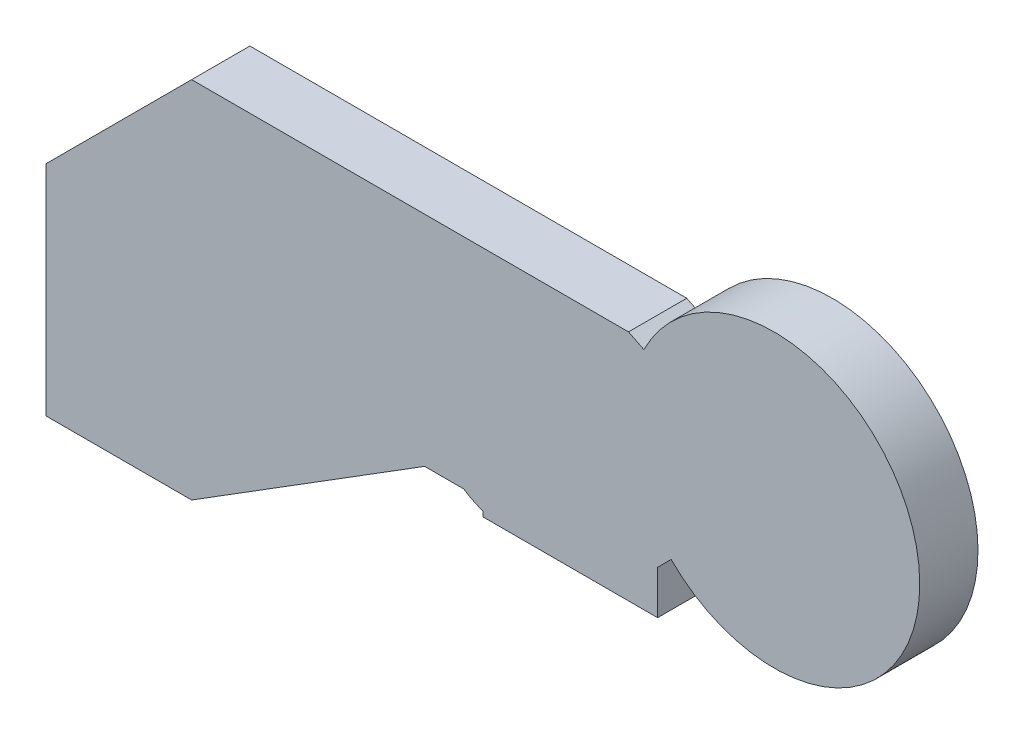
ISO-10303-21;
HEADER;
FILE_DESCRIPTION(('STEP AP214'),'2;1');
FILE_NAME('part.step','',(''),(''),'','','');
FILE_SCHEMA(('AUTOMOTIVE_DESIGN { 1 0 10303 214 1 1 1 1 }'));
ENDSEC;
DATA;
#1=APPLICATION_CONTEXT('core data for automotive mechanical design processes');
#2=APPLICATION_PROTOCOL_DEFINITION('international standard','automotive_design',2000,#1);
#3=PRODUCT_CONTEXT('',#1,'mechanical');
#4=PRODUCT('Part','Part','',(#3));
#5=PRODUCT_RELATED_PRODUCT_CATEGORY('part','',(#4));
#6=PRODUCT_DEFINITION_FORMATION('','',#4);
#7=PRODUCT_DEFINITION_CONTEXT('part definition',#1,'design');
#8=PRODUCT_DEFINITION('design','',#6,#7);
#9=PRODUCT_DEFINITION_SHAPE('','',#8);
#10=(LENGTH_UNIT() NAMED_UNIT(*) SI_UNIT(.MILLI.,.METRE.));
#11=(NAMED_UNIT(*) PLANE_ANGLE_UNIT() SI_UNIT($,.RADIAN.));
#12=(NAMED_UNIT(*) SI_UNIT($,.STERADIAN.) SOLID_ANGLE_UNIT());
#13=UNCERTAINTY_MEASURE_WITH_UNIT(LENGTH_MEASURE(1.E-05),#10,'distance_accuracy_value','');
#14=(GEOMETRIC_REPRESENTATION_CONTEXT(3) GLOBAL_UNCERTAINTY_ASSIGNED_CONTEXT((#13)) GLOBAL_UNIT_ASSIGNED_CONTEXT((#10,
#11,#12)) REPRESENTATION_CONTEXT('',''));
#15=CARTESIAN_POINT('',(0.,0.,0.));
#16=DIRECTION('',(0.,0.,1.));
#17=DIRECTION('',(1.,0.,0.));
#18=AXIS2_PLACEMENT_3D('',#15,#16,#17);
#19=CARTESIAN_POINT('',(40.,0.,4.));
#20=DIRECTION('',(-0.707106781186549,0.707106781186546,0.));
#21=DIRECTION('',(-0.707106781186546,-0.707106781186549,0.));
#22=AXIS2_PLACEMENT_3D('',#19,#20,#21);
#23=PLANE('',#22);
#24=DIRECTION('',(0.,0.,1.));
#25=VECTOR('',#24,1.);
#26=CARTESIAN_POINT('',(42.,2.00000000000001,4.));
#27=LINE('',#26,#25);
#28=CARTESIAN_POINT('',(42.,2.00000000000001,0.));
#29=VERTEX_POINT('',#28);
#30=CARTESIAN_POINT('',(42.,2.00000000000001,4.));
#31=VERTEX_POINT('',#30);
#32=EDGE_CURVE('E59',#29,#31,#27,.T.);
#33=ORIENTED_EDGE('',*,*,#32,.F.);
#34=DIRECTION('',(0.707106781186546,0.707106781186549,0.));
#35=VECTOR('',#34,1.);
#36=CARTESIAN_POINT('',(40.,0.,0.));
#37=LINE('',#36,#35);
#38=CARTESIAN_POINT('',(42.9289321881345,2.92893218813452,0.));
#39=VERTEX_POINT('',#38);
#40=EDGE_CURVE('E208',#29,#39,#37,.T.);
#41=ORIENTED_EDGE('',*,*,#40,.T.);
#42=DIRECTION('',(0.,0.,-1.));
#43=VECTOR('',#42,1.);
#44=CARTESIAN_POINT('',(42.9289321881345,2.92893218813452,4.));
#45=LINE('',#44,#43);
#46=CARTESIAN_POINT('',(42.9289321881345,2.92893218813452,4.));
#47=VERTEX_POINT('',#46);
#48=EDGE_CURVE('E176',#47,#39,#45,.T.);
#49=ORIENTED_EDGE('',*,*,#48,.F.);
#50=DIRECTION('',(0.707106781186546,0.707106781186549,0.));
#51=VECTOR('',#50,1.);
#52=CARTESIAN_POINT('',(40.,0.,4.));
#53=LINE('',#52,#51);
#54=EDGE_CURVE('E53',#31,#47,#53,.T.);
#55=ORIENTED_EDGE('',*,*,#54,.F.);
#56=EDGE_LOOP('',(#33,#41,#49,#55));
#57=FACE_BOUND('',#56,.T.);
#58=ADVANCED_FACE('F39',(#57),#23,.F.);
#59=CARTESIAN_POINT('',(32.,5.,4.));
#60=DIRECTION('',(0.,0.,-1.));
#61=DIRECTION('',(-1.,0.,0.));
#62=AXIS2_PLACEMENT_3D('',#59,#60,#61);
#63=CYLINDRICAL_SURFACE('',#62,6.);
#64=DIRECTION('',(0.,0.,-1.));
#65=VECTOR('',#64,1.);
#66=CARTESIAN_POINT('',(30.,-0.656854249492381,4.));
#67=LINE('',#66,#65);
#68=CARTESIAN_POINT('',(30.,-0.656854249492381,4.));
#69=VERTEX_POINT('',#68);
#70=CARTESIAN_POINT('',(30.,-0.656854249492381,0.));
#71=VERTEX_POINT('',#70);
#72=EDGE_CURVE('E11',#69,#71,#67,.T.);
#73=ORIENTED_EDGE('',*,*,#72,.F.);
#74=CARTESIAN_POINT('',(32.,5.,4.));
#75=DIRECTION('',(0.,0.,1.));
#76=DIRECTION('',(1.,0.,0.));
#77=AXIS2_PLACEMENT_3D('',#74,#75,#76);
#78=CIRCLE('',#77,6.);
#79=CARTESIAN_POINT('',(28.6833752096446,0.,4.));
#80=VERTEX_POINT('',#79);
#81=EDGE_CURVE('E136',#80,#69,#78,.T.);
#82=ORIENTED_EDGE('',*,*,#81,.F.);
#83=DIRECTION('',(0.,0.,-1.));
#84=VECTOR('',#83,1.);
#85=CARTESIAN_POINT('',(28.6833752096446,0.,4.));
#86=LINE('',#85,#84);
#87=CARTESIAN_POINT('',(28.6833752096446,0.,0.));
#88=VERTEX_POINT('',#87);
#89=EDGE_CURVE('E164',#80,#88,#86,.T.);
#90=ORIENTED_EDGE('',*,*,#89,.T.);
#91=CARTESIAN_POINT('',(32.,5.,0.));
#92=DIRECTION('',(0.,0.,1.));
#93=DIRECTION('',(1.,0.,0.));
#94=AXIS2_PLACEMENT_3D('',#91,#92,#93);
#95=CIRCLE('',#94,6.);
#96=EDGE_CURVE('E157',#88,#71,#95,.T.);
#97=ORIENTED_EDGE('',*,*,#96,.T.);
#98=EDGE_LOOP('',(#73,#82,#90,#97));
#99=FACE_BOUND('',#98,.T.);
#100=ADVANCED_FACE('F252',(#99),#63,.T.);
#101=CARTESIAN_POINT('',(26.,0.,4.));
#102=DIRECTION('',(0.,1.,0.));
#103=DIRECTION('',(0.,0.,1.));
#104=AXIS2_PLACEMENT_3D('',#101,#102,#103);
#105=PLANE('',#104);
#106=ORIENTED_EDGE('',*,*,#89,.F.);
#107=DIRECTION('',(1.,0.,0.));
#108=VECTOR('',#107,1.);
#109=CARTESIAN_POINT('',(26.,0.,4.));
#110=LINE('',#109,#108);
#111=CARTESIAN_POINT('',(26.,0.,4.));
#112=VERTEX_POINT('',#111);
#113=EDGE_CURVE('E187',#112,#80,#110,.T.);
#114=ORIENTED_EDGE('',*,*,#113,.F.);
#115=DIRECTION('',(0.,0.,-1.));
#116=VECTOR('',#115,1.);
#117=CARTESIAN_POINT('',(26.,0.,4.));
#118=LINE('',#117,#116);
#119=CARTESIAN_POINT('',(26.,0.,0.));
#120=VERTEX_POINT('',#119);
#121=EDGE_CURVE('E224',#112,#120,#118,.T.);
#122=ORIENTED_EDGE('',*,*,#121,.T.);
#123=DIRECTION('',(1.,0.,0.));
#124=VECTOR('',#123,1.);
#125=CARTESIAN_POINT('',(26.,0.,0.));
#126=LINE('',#125,#124);
#127=EDGE_CURVE('E206',#120,#88,#126,.T.);
#128=ORIENTED_EDGE('',*,*,#127,.T.);
#129=EDGE_LOOP('',(#106,#114,#122,#128));
#130=FACE_BOUND('',#129,.T.);
#131=ADVANCED_FACE('F246',(#130),#105,.F.);
#132=CARTESIAN_POINT('',(50.,10.,4.));
#133=DIRECTION('',(-0.447213595499957,-0.894427190999917,0.));
#134=DIRECTION('',(0.894427190999917,-0.447213595499957,0.));
#135=AXIS2_PLACEMENT_3D('',#132,#133,#134);
#136=PLANE('',#135);
#137=DIRECTION('',(0.,0.,-1.));
#138=VECTOR('',#137,1.);
#139=CARTESIAN_POINT('',(41.0557280900008,14.4721359549996,4.));
#140=LINE('',#139,#138);
#141=CARTESIAN_POINT('',(41.0557280900008,14.4721359549996,0.));
#142=VERTEX_POINT('',#141);
#143=CARTESIAN_POINT('',(41.0557280900008,14.4721359549996,4.));
#144=VERTEX_POINT('',#143);
#145=EDGE_CURVE('E175',#142,#144,#140,.F.);
#146=ORIENTED_EDGE('',*,*,#145,.F.);
#147=DIRECTION('',(-0.894427190999916,0.447213595499957,0.));
#148=VECTOR('',#147,1.);
#149=CARTESIAN_POINT('',(50.,10.,0.));
#150=LINE('',#149,#148);
#151=CARTESIAN_POINT('',(40.,15.,0.));
#152=VERTEX_POINT('',#151);
#153=EDGE_CURVE('E209',#142,#152,#150,.T.);
#154=ORIENTED_EDGE('',*,*,#153,.T.);
#155=DIRECTION('',(0.,0.,-1.));
#156=VECTOR('',#155,1.);
#157=CARTESIAN_POINT('',(40.,15.,4.));
#158=LINE('',#157,#156);
#159=CARTESIAN_POINT('',(40.,15.,4.));
#160=VERTEX_POINT('',#159);
#161=EDGE_CURVE('E219',#160,#152,#158,.T.);
#162=ORIENTED_EDGE('',*,*,#161,.F.);
#163=DIRECTION('',(-0.894427190999916,0.447213595499957,0.));
#164=VECTOR('',#163,1.);
#165=CARTESIAN_POINT('',(50.,10.,4.));
#166=LINE('',#165,#164);
#167=EDGE_CURVE('E192',#144,#160,#166,.T.);
#168=ORIENTED_EDGE('',*,*,#167,.F.);
#169=EDGE_LOOP('',(#146,#154,#162,#168));
#170=FACE_BOUND('',#169,.T.);
#171=ADVANCED_FACE('F269',(#170),#136,.F.);
#172=CARTESIAN_POINT('',(0.,4.99999999999996,4.));
#173=DIRECTION('',(1.,0.,0.));
#174=DIRECTION('',(0.,1.,0.));
#175=AXIS2_PLACEMENT_3D('',#172,#173,#174);
#176=PLANE('',#175);
#177=DIRECTION('',(0.,-1.,0.));
#178=VECTOR('',#177,1.);
#179=CARTESIAN_POINT('',(0.,4.99999999999996,0.));
#180=LINE('',#179,#178);
#181=CARTESIAN_POINT('',(0.,4.99999999999996,0.));
#182=VERTEX_POINT('',#181);
#183=CARTESIAN_POINT('',(0.,-10.,0.));
#184=VERTEX_POINT('',#183);
#185=EDGE_CURVE('E182',#182,#184,#180,.T.);
#186=ORIENTED_EDGE('',*,*,#185,.T.);
#187=DIRECTION('',(0.,0.,-1.));
#188=VECTOR('',#187,1.);
#189=CARTESIAN_POINT('',(0.,-10.,4.));
#190=LINE('',#189,#188);
#191=CARTESIAN_POINT('',(0.,-10.,4.));
#192=VERTEX_POINT('',#191);
#193=EDGE_CURVE('E50',#192,#184,#190,.T.);
#194=ORIENTED_EDGE('',*,*,#193,.F.);
#195=DIRECTION('',(0.,-1.,0.));
#196=VECTOR('',#195,1.);
#197=CARTESIAN_POINT('',(0.,4.99999999999996,4.));
#198=LINE('',#197,#196);
#199=CARTESIAN_POINT('',(0.,4.99999999999996,4.));
#200=VERTEX_POINT('',#199);
#201=EDGE_CURVE('E185',#200,#192,#198,.T.);
#202=ORIENTED_EDGE('',*,*,#201,.F.);
#203=DIRECTION('',(0.,0.,-1.));
#204=VECTOR('',#203,1.);
#205=CARTESIAN_POINT('',(0.,4.99999999999996,4.));
#206=LINE('',#205,#204);
#207=EDGE_CURVE('E200',#200,#182,#206,.T.);
#208=ORIENTED_EDGE('',*,*,#207,.T.);
#209=EDGE_LOOP('',(#186,#194,#202,#208));
#210=FACE_BOUND('',#209,.T.);
#211=ADVANCED_FACE('F41',(#210),#176,.F.);
#212=CARTESIAN_POINT('',(0.,-10.,4.));
#213=DIRECTION('',(0.,1.,0.));
#214=DIRECTION('',(0.,0.,1.));
#215=AXIS2_PLACEMENT_3D('',#212,#213,#214);
#216=PLANE('',#215);
#217=DIRECTION('',(1.,0.,0.));
#218=VECTOR('',#217,1.);
#219=CARTESIAN_POINT('',(0.,-10.,0.));
#220=LINE('',#219,#218);
#221=CARTESIAN_POINT('',(10.,-10.,0.));
#222=VERTEX_POINT('',#221);
#223=EDGE_CURVE('E205',#184,#222,#220,.T.);
#224=ORIENTED_EDGE('',*,*,#223,.T.);
#225=DIRECTION('',(0.,0.,-1.));
#226=VECTOR('',#225,1.);
#227=CARTESIAN_POINT('',(10.,-10.,4.));
#228=LINE('',#227,#226);
#229=CARTESIAN_POINT('',(10.,-10.,4.));
#230=VERTEX_POINT('',#229);
#231=EDGE_CURVE('E229',#230,#222,#228,.T.);
#232=ORIENTED_EDGE('',*,*,#231,.F.);
#233=DIRECTION('',(1.,0.,0.));
#234=VECTOR('',#233,1.);
#235=CARTESIAN_POINT('',(0.,-10.,4.));
#236=LINE('',#235,#234);
#237=EDGE_CURVE('E183',#192,#230,#236,.T.);
#238=ORIENTED_EDGE('',*,*,#237,.F.);
#239=ORIENTED_EDGE('',*,*,#193,.T.);
#240=EDGE_LOOP('',(#224,#232,#238,#239));
#241=FACE_BOUND('',#240,.T.);
#242=ADVANCED_FACE('F233',(#241),#216,.F.);
#243=CARTESIAN_POINT('',(10.,-10.,4.));
#244=DIRECTION('',(-0.52999894000318,0.847998304005088,0.));
#245=DIRECTION('',(-0.847998304005088,-0.52999894000318,0.));
#246=AXIS2_PLACEMENT_3D('',#243,#244,#245);
#247=PLANE('',#246);
#248=DIRECTION('',(0.847998304005088,0.52999894000318,0.));
#249=VECTOR('',#248,1.);
#250=CARTESIAN_POINT('',(10.,-10.,0.));
#251=LINE('',#250,#249);
#252=EDGE_CURVE('E204',#222,#120,#251,.T.);
#253=ORIENTED_EDGE('',*,*,#252,.T.);
#254=ORIENTED_EDGE('',*,*,#121,.F.);
#255=DIRECTION('',(0.847998304005088,0.52999894000318,0.));
#256=VECTOR('',#255,1.);
#257=CARTESIAN_POINT('',(10.,-10.,4.));
#258=LINE('',#257,#256);
#259=EDGE_CURVE('E190',#230,#112,#258,.T.);
#260=ORIENTED_EDGE('',*,*,#259,.F.);
#261=ORIENTED_EDGE('',*,*,#231,.T.);
#262=EDGE_LOOP('',(#253,#254,#260,#261));
#263=FACE_BOUND('',#262,.T.);
#264=ADVANCED_FACE('F248',(#263),#247,.F.);
#265=CARTESIAN_POINT('',(40.,15.,4.));
#266=DIRECTION('',(0.,-1.,0.));
#267=DIRECTION('',(0.,0.,-1.));
#268=AXIS2_PLACEMENT_3D('',#265,#266,#267);
#269=PLANE('',#268);
#270=DIRECTION('',(-1.,0.,0.));
#271=VECTOR('',#270,1.);
#272=CARTESIAN_POINT('',(40.,15.,0.));
#273=LINE('',#272,#271);
#274=CARTESIAN_POINT('',(10.,15.,0.));
#275=VERTEX_POINT('',#274);
#276=EDGE_CURVE('E215',#152,#275,#273,.T.);
#277=ORIENTED_EDGE('',*,*,#276,.T.);
#278=DIRECTION('',(0.,0.,-1.));
#279=VECTOR('',#278,1.);
#280=CARTESIAN_POINT('',(10.,15.,4.));
#281=LINE('',#280,#279);
#282=CARTESIAN_POINT('',(10.,15.,4.));
#283=VERTEX_POINT('',#282);
#284=EDGE_CURVE('E220',#283,#275,#281,.T.);
#285=ORIENTED_EDGE('',*,*,#284,.F.);
#286=DIRECTION('',(-1.,0.,0.));
#287=VECTOR('',#286,1.);
#288=CARTESIAN_POINT('',(40.,15.,4.));
#289=LINE('',#288,#287);
#290=EDGE_CURVE('E191',#160,#283,#289,.T.);
#291=ORIENTED_EDGE('',*,*,#290,.F.);
#292=ORIENTED_EDGE('',*,*,#161,.T.);
#293=EDGE_LOOP('',(#277,#285,#291,#292));
#294=FACE_BOUND('',#293,.T.);
#295=ADVANCED_FACE('F275',(#294),#269,.F.);
#296=CARTESIAN_POINT('',(10.,15.,4.));
#297=DIRECTION('',(0.707106781186549,-0.707106781186546,0.));
#298=DIRECTION('',(0.707106781186546,0.707106781186549,0.));
#299=AXIS2_PLACEMENT_3D('',#296,#297,#298);
#300=PLANE('',#299);
#301=DIRECTION('',(-0.707106781186546,-0.707106781186549,0.));
#302=VECTOR('',#301,1.);
#303=CARTESIAN_POINT('',(10.,15.,0.));
#304=LINE('',#303,#302);
#305=EDGE_CURVE('E189',#275,#182,#304,.T.);
#306=ORIENTED_EDGE('',*,*,#305,.T.);
#307=ORIENTED_EDGE('',*,*,#207,.F.);
#308=DIRECTION('',(-0.707106781186546,-0.707106781186549,0.));
#309=VECTOR('',#308,1.);
#310=CARTESIAN_POINT('',(10.,15.,4.));
#311=LINE('',#310,#309);
#312=EDGE_CURVE('E197',#283,#200,#311,.T.);
#313=ORIENTED_EDGE('',*,*,#312,.F.);
#314=ORIENTED_EDGE('',*,*,#284,.T.);
#315=EDGE_LOOP('',(#306,#307,#313,#314));
#316=FACE_BOUND('',#315,.T.);
#317=ADVANCED_FACE('F274',(#316),#300,.F.);
#318=CARTESIAN_POINT('',(0.,0.,4.));
#319=DIRECTION('',(0.,0.,1.));
#320=DIRECTION('',(1.,0.,0.));
#321=AXIS2_PLACEMENT_3D('',#318,#319,#320);
#322=PLANE('',#321);
#323=DIRECTION('',(0.,1.,0.));
#324=VECTOR('',#323,1.);
#325=CARTESIAN_POINT('',(42.,-1.00000000000001,4.));
#326=LINE('',#325,#324);
#327=CARTESIAN_POINT('',(42.,-1.00000000000001,4.));
#328=VERTEX_POINT('',#327);
#329=EDGE_CURVE('E155',#328,#31,#326,.T.);
#330=ORIENTED_EDGE('',*,*,#329,.T.);
#331=ORIENTED_EDGE('',*,*,#54,.T.);
#332=CARTESIAN_POINT('',(50.,10.,4.));
#333=DIRECTION('',(0.,0.,1.));
#334=DIRECTION('',(1.,0.,0.));
#335=AXIS2_PLACEMENT_3D('',#332,#333,#334);
#336=CIRCLE('',#335,10.);
#337=EDGE_CURVE('E168',#47,#144,#336,.T.);
#338=ORIENTED_EDGE('',*,*,#337,.T.);
#339=ORIENTED_EDGE('',*,*,#167,.T.);
#340=ORIENTED_EDGE('',*,*,#290,.T.);
#341=ORIENTED_EDGE('',*,*,#312,.T.);
#342=ORIENTED_EDGE('',*,*,#201,.T.);
#343=ORIENTED_EDGE('',*,*,#237,.T.);
#344=ORIENTED_EDGE('',*,*,#259,.T.);
#345=ORIENTED_EDGE('',*,*,#113,.T.);
#346=ORIENTED_EDGE('',*,*,#81,.T.);
#347=DIRECTION('',(0.,-1.,0.));
#348=VECTOR('',#347,1.);
#349=CARTESIAN_POINT('',(30.,-1.00000000000001,4.));
#350=LINE('',#349,#348);
#351=CARTESIAN_POINT('',(30.,-1.00000000000001,4.));
#352=VERTEX_POINT('',#351);
#353=EDGE_CURVE('E131',#69,#352,#350,.T.);
#354=ORIENTED_EDGE('',*,*,#353,.T.);
#355=DIRECTION('',(1.,0.,0.));
#356=VECTOR('',#355,1.);
#357=CARTESIAN_POINT('',(30.,-1.00000000000001,4.));
#358=LINE('',#357,#356);
#359=EDGE_CURVE('E138',#352,#328,#358,.T.);
#360=ORIENTED_EDGE('',*,*,#359,.T.);
#361=EDGE_LOOP('',(#330,#331,#338,#339,#340,#341,#342,#343,#344,#345,#346,#354,#360));
#362=FACE_BOUND('',#361,.T.);
#363=ADVANCED_FACE('F132',(#362),#322,.T.);
#364=CARTESIAN_POINT('',(0.,0.,0.));
#365=DIRECTION('',(0.,0.,1.));
#366=DIRECTION('',(1.,0.,0.));
#367=AXIS2_PLACEMENT_3D('',#364,#365,#366);
#368=PLANE('',#367);
#369=ORIENTED_EDGE('',*,*,#40,.F.);
#370=DIRECTION('',(0.,1.,0.));
#371=VECTOR('',#370,1.);
#372=CARTESIAN_POINT('',(42.,-1.00000000000001,0.));
#373=LINE('',#372,#371);
#374=CARTESIAN_POINT('',(42.,-1.00000000000001,0.));
#375=VERTEX_POINT('',#374);
#376=EDGE_CURVE('E141',#375,#29,#373,.T.);
#377=ORIENTED_EDGE('',*,*,#376,.F.);
#378=DIRECTION('',(1.,0.,0.));
#379=VECTOR('',#378,1.);
#380=CARTESIAN_POINT('',(30.,-1.00000000000001,0.));
#381=LINE('',#380,#379);
#382=CARTESIAN_POINT('',(30.,-1.00000000000001,0.));
#383=VERTEX_POINT('',#382);
#384=EDGE_CURVE('E255',#383,#375,#381,.T.);
#385=ORIENTED_EDGE('',*,*,#384,.F.);
#386=DIRECTION('',(0.,-1.,0.));
#387=VECTOR('',#386,1.);
#388=CARTESIAN_POINT('',(30.,-1.00000000000001,0.));
#389=LINE('',#388,#387);
#390=EDGE_CURVE('E160',#71,#383,#389,.T.);
#391=ORIENTED_EDGE('',*,*,#390,.F.);
#392=ORIENTED_EDGE('',*,*,#96,.F.);
#393=ORIENTED_EDGE('',*,*,#127,.F.);
#394=ORIENTED_EDGE('',*,*,#252,.F.);
#395=ORIENTED_EDGE('',*,*,#223,.F.);
#396=ORIENTED_EDGE('',*,*,#185,.F.);
#397=ORIENTED_EDGE('',*,*,#305,.F.);
#398=ORIENTED_EDGE('',*,*,#276,.F.);
#399=ORIENTED_EDGE('',*,*,#153,.F.);
#400=CARTESIAN_POINT('',(50.,10.,0.));
#401=DIRECTION('',(0.,0.,1.));
#402=DIRECTION('',(1.,0.,0.));
#403=AXIS2_PLACEMENT_3D('',#400,#401,#402);
#404=CIRCLE('',#403,10.);
#405=EDGE_CURVE('E166',#39,#142,#404,.T.);
#406=ORIENTED_EDGE('',*,*,#405,.F.);
#407=EDGE_LOOP('',(#369,#377,#385,#391,#392,#393,#394,#395,#396,#397,#398,#399,#406));
#408=FACE_BOUND('',#407,.T.);
#409=ADVANCED_FACE('F239',(#408),#368,.F.);
#410=CARTESIAN_POINT('',(50.,10.,4.));
#411=DIRECTION('',(0.,0.,-1.));
#412=DIRECTION('',(-1.,0.,0.));
#413=AXIS2_PLACEMENT_3D('',#410,#411,#412);
#414=CYLINDRICAL_SURFACE('',#413,10.);
#415=ORIENTED_EDGE('',*,*,#337,.F.);
#416=ORIENTED_EDGE('',*,*,#48,.T.);
#417=ORIENTED_EDGE('',*,*,#405,.T.);
#418=ORIENTED_EDGE('',*,*,#145,.T.);
#419=EDGE_LOOP('',(#415,#416,#417,#418));
#420=FACE_BOUND('',#419,.T.);
#421=ADVANCED_FACE('F264',(#420),#414,.T.);
#422=CARTESIAN_POINT('',(42.,-1.00000000000001,4.));
#423=DIRECTION('',(-1.,0.,0.));
#424=DIRECTION('',(0.,0.,1.));
#425=AXIS2_PLACEMENT_3D('',#422,#423,#424);
#426=PLANE('',#425);
#427=ORIENTED_EDGE('',*,*,#376,.T.);
#428=ORIENTED_EDGE('',*,*,#32,.T.);
#429=ORIENTED_EDGE('',*,*,#329,.F.);
#430=DIRECTION('',(0.,0.,-1.));
#431=VECTOR('',#430,1.);
#432=CARTESIAN_POINT('',(42.,-1.00000000000001,4.));
#433=LINE('',#432,#431);
#434=EDGE_CURVE('E147',#328,#375,#433,.T.);
#435=ORIENTED_EDGE('',*,*,#434,.T.);
#436=EDGE_LOOP('',(#427,#428,#429,#435));
#437=FACE_BOUND('',#436,.T.);
#438=ADVANCED_FACE('F257',(#437),#426,.F.);
#439=CARTESIAN_POINT('',(30.,-1.00000000000001,4.));
#440=DIRECTION('',(1.,0.,0.));
#441=DIRECTION('',(0.,0.,-1.));
#442=AXIS2_PLACEMENT_3D('',#439,#440,#441);
#443=PLANE('',#442);
#444=ORIENTED_EDGE('',*,*,#353,.F.);
#445=ORIENTED_EDGE('',*,*,#72,.T.);
#446=ORIENTED_EDGE('',*,*,#390,.T.);
#447=DIRECTION('',(0.,0.,-1.));
#448=VECTOR('',#447,1.);
#449=CARTESIAN_POINT('',(30.,-1.00000000000001,4.));
#450=LINE('',#449,#448);
#451=EDGE_CURVE('E146',#352,#383,#450,.T.);
#452=ORIENTED_EDGE('',*,*,#451,.F.);
#453=EDGE_LOOP('',(#444,#445,#446,#452));
#454=FACE_BOUND('',#453,.T.);
#455=ADVANCED_FACE('F154',(#454),#443,.F.);
#456=CARTESIAN_POINT('',(30.,-1.00000000000001,4.));
#457=DIRECTION('',(0.,1.,0.));
#458=DIRECTION('',(0.,0.,1.));
#459=AXIS2_PLACEMENT_3D('',#456,#457,#458);
#460=PLANE('',#459);
#461=ORIENTED_EDGE('',*,*,#434,.F.);
#462=ORIENTED_EDGE('',*,*,#359,.F.);
#463=ORIENTED_EDGE('',*,*,#451,.T.);
#464=ORIENTED_EDGE('',*,*,#384,.T.);
#465=EDGE_LOOP('',(#461,#462,#463,#464));
#466=FACE_BOUND('',#465,.T.);
#467=ADVANCED_FACE('F150',(#466),#460,.F.);
#468=CLOSED_SHELL('',(#58,#100,#131,#171,#211,#242,#264,#295,#317,#363,#409,#421,#438,#455,#467));
#469=MANIFOLD_SOLID_BREP('B2',#468);
#470=ADVANCED_BREP_SHAPE_REPRESENTATION('',(#18,#469),#14);
#471=SHAPE_DEFINITION_REPRESENTATION(#9,#470);
ENDSEC;
END-ISO-10303-21;
